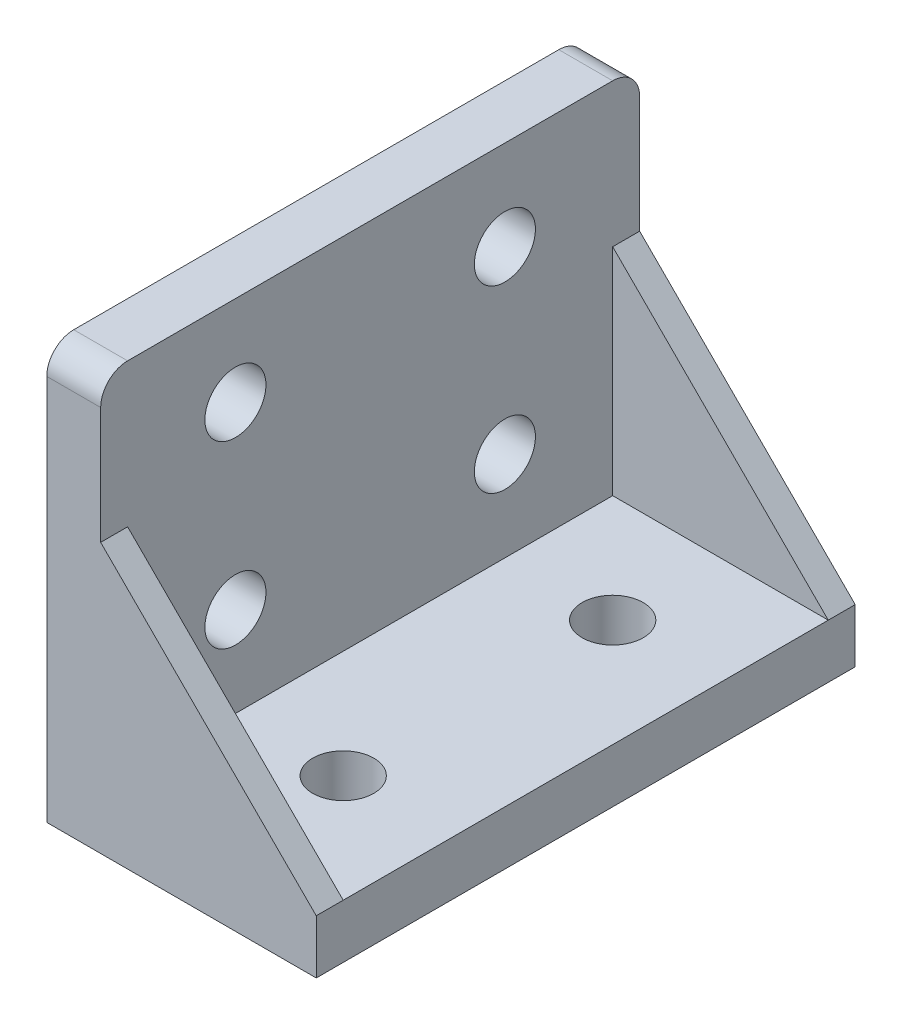
ISO-10303-21;
HEADER;
FILE_DESCRIPTION(('STEP AP214'),'2;1');
FILE_NAME('part.step','',(''),(''),'','','');
FILE_SCHEMA(('AUTOMOTIVE_DESIGN { 1 0 10303 214 1 1 1 1 }'));
ENDSEC;
DATA;
#1=APPLICATION_CONTEXT('core data for automotive mechanical design processes');
#2=APPLICATION_PROTOCOL_DEFINITION('international standard','automotive_design',2000,#1);
#3=PRODUCT_CONTEXT('',#1,'mechanical');
#4=PRODUCT('Part','Part','',(#3));
#5=PRODUCT_RELATED_PRODUCT_CATEGORY('part','',(#4));
#6=PRODUCT_DEFINITION_FORMATION('','',#4);
#7=PRODUCT_DEFINITION_CONTEXT('part definition',#1,'design');
#8=PRODUCT_DEFINITION('design','',#6,#7);
#9=PRODUCT_DEFINITION_SHAPE('','',#8);
#10=(LENGTH_UNIT() NAMED_UNIT(*) SI_UNIT(.MILLI.,.METRE.));
#11=(NAMED_UNIT(*) PLANE_ANGLE_UNIT() SI_UNIT($,.RADIAN.));
#12=(NAMED_UNIT(*) SI_UNIT($,.STERADIAN.) SOLID_ANGLE_UNIT());
#13=UNCERTAINTY_MEASURE_WITH_UNIT(LENGTH_MEASURE(1.E-05),#10,'distance_accuracy_value','');
#14=(GEOMETRIC_REPRESENTATION_CONTEXT(3) GLOBAL_UNCERTAINTY_ASSIGNED_CONTEXT((#13)) GLOBAL_UNIT_ASSIGNED_CONTEXT((#10,
#11,#12)) REPRESENTATION_CONTEXT('',''));
#15=CARTESIAN_POINT('',(0.,0.,0.));
#16=DIRECTION('',(0.,0.,1.));
#17=DIRECTION('',(1.,0.,0.));
#18=AXIS2_PLACEMENT_3D('',#15,#16,#17);
#19=CARTESIAN_POINT('',(12.,0.,30.));
#20=DIRECTION('',(0.,-1.,0.));
#21=DIRECTION('',(1.,0.,0.));
#22=AXIS2_PLACEMENT_3D('',#19,#20,#21);
#23=PLANE('',#22);
#24=CARTESIAN_POINT('',(6.,0.,22.5));
#25=DIRECTION('',(0.,1.,0.));
#26=DIRECTION('',(0.,0.,1.));
#27=AXIS2_PLACEMENT_3D('',#24,#25,#26);
#28=CIRCLE('',#27,1.7);
#29=CARTESIAN_POINT('',(6.,0.,24.2));
#30=VERTEX_POINT('',#29);
#31=EDGE_CURVE('E304',#30,#30,#28,.T.);
#32=ORIENTED_EDGE('',*,*,#31,.F.);
#33=EDGE_LOOP('',(#32));
#34=FACE_BOUND('',#33,.T.);
#35=CARTESIAN_POINT('',(6.,0.,7.5));
#36=DIRECTION('',(0.,1.,0.));
#37=DIRECTION('',(0.,0.,1.));
#38=AXIS2_PLACEMENT_3D('',#35,#36,#37);
#39=CIRCLE('',#38,1.7);
#40=CARTESIAN_POINT('',(6.,0.,9.2));
#41=VERTEX_POINT('',#40);
#42=EDGE_CURVE('E306',#41,#41,#39,.T.);
#43=ORIENTED_EDGE('',*,*,#42,.F.);
#44=EDGE_LOOP('',(#43));
#45=FACE_BOUND('',#44,.T.);
#46=DIRECTION('',(1.,0.,0.));
#47=VECTOR('',#46,1.);
#48=CARTESIAN_POINT('',(0.,0.,28.5));
#49=LINE('',#48,#47);
#50=CARTESIAN_POINT('',(0.,0.,28.5));
#51=VERTEX_POINT('',#50);
#52=CARTESIAN_POINT('',(12.,0.,28.5));
#53=VERTEX_POINT('',#52);
#54=EDGE_CURVE('E127',#51,#53,#49,.T.);
#55=ORIENTED_EDGE('',*,*,#54,.T.);
#56=DIRECTION('',(0.,0.,-1.));
#57=VECTOR('',#56,1.);
#58=CARTESIAN_POINT('',(12.,0.,30.));
#59=LINE('',#58,#57);
#60=CARTESIAN_POINT('',(12.,0.,1.5));
#61=VERTEX_POINT('',#60);
#62=EDGE_CURVE('E172',#53,#61,#59,.T.);
#63=ORIENTED_EDGE('',*,*,#62,.T.);
#64=DIRECTION('',(1.,0.,0.));
#65=VECTOR('',#64,1.);
#66=CARTESIAN_POINT('',(0.,0.,1.5));
#67=LINE('',#66,#65);
#68=CARTESIAN_POINT('',(0.,0.,1.5));
#69=VERTEX_POINT('',#68);
#70=EDGE_CURVE('E151',#69,#61,#67,.T.);
#71=ORIENTED_EDGE('',*,*,#70,.F.);
#72=DIRECTION('',(0.,0.,-1.));
#73=VECTOR('',#72,1.);
#74=CARTESIAN_POINT('',(0.,0.,30.));
#75=LINE('',#74,#73);
#76=EDGE_CURVE('E192',#51,#69,#75,.T.);
#77=ORIENTED_EDGE('',*,*,#76,.F.);
#78=EDGE_LOOP('',(#55,#63,#71,#77));
#79=FACE_BOUND('',#78,.T.);
#80=ADVANCED_FACE('F35',(#34,#45,#79),#23,.F.);
#81=CARTESIAN_POINT('',(0.,0.,30.));
#82=DIRECTION('',(-1.,0.,0.));
#83=DIRECTION('',(0.,0.,1.));
#84=AXIS2_PLACEMENT_3D('',#81,#82,#83);
#85=PLANE('',#84);
#86=CARTESIAN_POINT('',(0.,15.,7.5));
#87=DIRECTION('',(1.,0.,0.));
#88=DIRECTION('',(0.,0.,-1.));
#89=AXIS2_PLACEMENT_3D('',#86,#87,#88);
#90=CIRCLE('',#89,1.7);
#91=CARTESIAN_POINT('',(0.,15.,5.8));
#92=VERTEX_POINT('',#91);
#93=EDGE_CURVE('E314',#92,#92,#90,.T.);
#94=ORIENTED_EDGE('',*,*,#93,.F.);
#95=EDGE_LOOP('',(#94));
#96=FACE_BOUND('',#95,.T.);
#97=CARTESIAN_POINT('',(0.,15.,22.5));
#98=DIRECTION('',(1.,0.,0.));
#99=DIRECTION('',(0.,0.,-1.));
#100=AXIS2_PLACEMENT_3D('',#97,#98,#99);
#101=CIRCLE('',#100,1.7);
#102=CARTESIAN_POINT('',(0.,15.,20.8));
#103=VERTEX_POINT('',#102);
#104=EDGE_CURVE('E320',#103,#103,#101,.T.);
#105=ORIENTED_EDGE('',*,*,#104,.F.);
#106=EDGE_LOOP('',(#105));
#107=FACE_BOUND('',#106,.T.);
#108=CARTESIAN_POINT('',(0.,5.00000000000001,22.5));
#109=DIRECTION('',(1.,0.,0.));
#110=DIRECTION('',(0.,0.,-1.));
#111=AXIS2_PLACEMENT_3D('',#108,#109,#110);
#112=CIRCLE('',#111,1.7);
#113=CARTESIAN_POINT('',(0.,5.00000000000001,20.8));
#114=VERTEX_POINT('',#113);
#115=EDGE_CURVE('E326',#114,#114,#112,.T.);
#116=ORIENTED_EDGE('',*,*,#115,.F.);
#117=EDGE_LOOP('',(#116));
#118=FACE_BOUND('',#117,.T.);
#119=CARTESIAN_POINT('',(0.,5.00000000000002,7.49999999999999));
#120=DIRECTION('',(1.,0.,0.));
#121=DIRECTION('',(0.,0.,-1.));
#122=AXIS2_PLACEMENT_3D('',#119,#120,#121);
#123=CIRCLE('',#122,1.7);
#124=CARTESIAN_POINT('',(0.,5.00000000000002,5.79999999999999));
#125=VERTEX_POINT('',#124);
#126=EDGE_CURVE('E332',#125,#125,#123,.T.);
#127=ORIENTED_EDGE('',*,*,#126,.F.);
#128=EDGE_LOOP('',(#127));
#129=FACE_BOUND('',#128,.T.);
#130=DIRECTION('',(0.,1.,0.));
#131=VECTOR('',#130,1.);
#132=CARTESIAN_POINT('',(0.,0.,0.));
#133=LINE('',#132,#131);
#134=CARTESIAN_POINT('',(0.,12.,0.));
#135=VERTEX_POINT('',#134);
#136=CARTESIAN_POINT('',(0.,18.5,0.));
#137=VERTEX_POINT('',#136);
#138=EDGE_CURVE('E162',#135,#137,#133,.T.);
#139=ORIENTED_EDGE('',*,*,#138,.T.);
#140=CARTESIAN_POINT('',(0.,18.5,1.5));
#141=DIRECTION('',(-1.,0.,0.));
#142=DIRECTION('',(0.,0.,1.));
#143=AXIS2_PLACEMENT_3D('',#140,#141,#142);
#144=CIRCLE('',#143,1.5);
#145=CARTESIAN_POINT('',(0.,20.,1.5));
#146=VERTEX_POINT('',#145);
#147=EDGE_CURVE('E43',#137,#146,#144,.F.);
#148=ORIENTED_EDGE('',*,*,#147,.T.);
#149=DIRECTION('',(0.,0.,-1.));
#150=VECTOR('',#149,1.);
#151=CARTESIAN_POINT('',(0.,20.,30.));
#152=LINE('',#151,#150);
#153=CARTESIAN_POINT('',(0.,20.,28.5));
#154=VERTEX_POINT('',#153);
#155=EDGE_CURVE('E189',#154,#146,#152,.T.);
#156=ORIENTED_EDGE('',*,*,#155,.F.);
#157=CARTESIAN_POINT('',(0.,18.5,28.5));
#158=DIRECTION('',(-1.,0.,0.));
#159=DIRECTION('',(0.,0.,1.));
#160=AXIS2_PLACEMENT_3D('',#157,#158,#159);
#161=CIRCLE('',#160,1.5);
#162=CARTESIAN_POINT('',(0.,18.5,30.));
#163=VERTEX_POINT('',#162);
#164=EDGE_CURVE('E50',#154,#163,#161,.F.);
#165=ORIENTED_EDGE('',*,*,#164,.T.);
#166=DIRECTION('',(0.,1.,0.));
#167=VECTOR('',#166,1.);
#168=CARTESIAN_POINT('',(0.,0.,30.));
#169=LINE('',#168,#167);
#170=CARTESIAN_POINT('',(0.,12.,30.));
#171=VERTEX_POINT('',#170);
#172=EDGE_CURVE('E140',#171,#163,#169,.T.);
#173=ORIENTED_EDGE('',*,*,#172,.F.);
#174=DIRECTION('',(0.,0.,1.));
#175=VECTOR('',#174,1.);
#176=CARTESIAN_POINT('',(0.,12.,28.5));
#177=LINE('',#176,#175);
#178=CARTESIAN_POINT('',(0.,12.,28.5));
#179=VERTEX_POINT('',#178);
#180=EDGE_CURVE('E134',#179,#171,#177,.T.);
#181=ORIENTED_EDGE('',*,*,#180,.F.);
#182=DIRECTION('',(0.,-1.,0.));
#183=VECTOR('',#182,1.);
#184=CARTESIAN_POINT('',(0.,0.,28.5));
#185=LINE('',#184,#183);
#186=EDGE_CURVE('E122',#179,#51,#185,.T.);
#187=ORIENTED_EDGE('',*,*,#186,.T.);
#188=ORIENTED_EDGE('',*,*,#76,.T.);
#189=DIRECTION('',(0.,-1.,0.));
#190=VECTOR('',#189,1.);
#191=CARTESIAN_POINT('',(0.,12.,1.5));
#192=LINE('',#191,#190);
#193=CARTESIAN_POINT('',(0.,12.,1.5));
#194=VERTEX_POINT('',#193);
#195=EDGE_CURVE('E144',#194,#69,#192,.T.);
#196=ORIENTED_EDGE('',*,*,#195,.F.);
#197=DIRECTION('',(0.,0.,-1.));
#198=VECTOR('',#197,1.);
#199=CARTESIAN_POINT('',(0.,12.,1.5));
#200=LINE('',#199,#198);
#201=EDGE_CURVE('E156',#194,#135,#200,.T.);
#202=ORIENTED_EDGE('',*,*,#201,.T.);
#203=EDGE_LOOP('',(#139,#148,#156,#165,#173,#181,#187,#188,#196,#202));
#204=FACE_BOUND('',#203,.T.);
#205=ADVANCED_FACE('F139',(#96,#107,#118,#129,#204),#85,.F.);
#206=CARTESIAN_POINT('',(0.,20.,30.));
#207=DIRECTION('',(0.,-1.,0.));
#208=DIRECTION('',(1.,0.,0.));
#209=AXIS2_PLACEMENT_3D('',#206,#207,#208);
#210=PLANE('',#209);
#211=ORIENTED_EDGE('',*,*,#155,.T.);
#212=DIRECTION('',(-1.,0.,0.));
#213=VECTOR('',#212,1.);
#214=CARTESIAN_POINT('',(-3.,20.,1.5));
#215=LINE('',#214,#213);
#216=CARTESIAN_POINT('',(-3.,20.,1.5));
#217=VERTEX_POINT('',#216);
#218=EDGE_CURVE('E196',#146,#217,#215,.T.);
#219=ORIENTED_EDGE('',*,*,#218,.T.);
#220=DIRECTION('',(0.,0.,-1.));
#221=VECTOR('',#220,1.);
#222=CARTESIAN_POINT('',(-3.,20.,30.));
#223=LINE('',#222,#221);
#224=CARTESIAN_POINT('',(-3.,20.,28.5));
#225=VERTEX_POINT('',#224);
#226=EDGE_CURVE('E186',#225,#217,#223,.T.);
#227=ORIENTED_EDGE('',*,*,#226,.F.);
#228=DIRECTION('',(-1.,0.,0.));
#229=VECTOR('',#228,1.);
#230=CARTESIAN_POINT('',(0.,20.,28.5));
#231=LINE('',#230,#229);
#232=EDGE_CURVE('E194',#225,#154,#231,.F.);
#233=ORIENTED_EDGE('',*,*,#232,.T.);
#234=EDGE_LOOP('',(#211,#219,#227,#233));
#235=FACE_BOUND('',#234,.T.);
#236=ADVANCED_FACE('F208',(#235),#210,.F.);
#237=CARTESIAN_POINT('',(-3.,20.,30.));
#238=DIRECTION('',(1.,0.,0.));
#239=DIRECTION('',(0.,1.,0.));
#240=AXIS2_PLACEMENT_3D('',#237,#238,#239);
#241=PLANE('',#240);
#242=CARTESIAN_POINT('',(-3.,15.,7.5));
#243=DIRECTION('',(1.,0.,0.));
#244=DIRECTION('',(0.,0.,-1.));
#245=AXIS2_PLACEMENT_3D('',#242,#243,#244);
#246=CIRCLE('',#245,1.7);
#247=CARTESIAN_POINT('',(-3.,15.,5.8));
#248=VERTEX_POINT('',#247);
#249=EDGE_CURVE('E317',#248,#248,#246,.T.);
#250=ORIENTED_EDGE('',*,*,#249,.T.);
#251=EDGE_LOOP('',(#250));
#252=FACE_BOUND('',#251,.T.);
#253=CARTESIAN_POINT('',(-3.,15.,22.5));
#254=DIRECTION('',(1.,0.,0.));
#255=DIRECTION('',(0.,0.,-1.));
#256=AXIS2_PLACEMENT_3D('',#253,#254,#255);
#257=CIRCLE('',#256,1.7);
#258=CARTESIAN_POINT('',(-3.,15.,20.8));
#259=VERTEX_POINT('',#258);
#260=EDGE_CURVE('E323',#259,#259,#257,.T.);
#261=ORIENTED_EDGE('',*,*,#260,.T.);
#262=EDGE_LOOP('',(#261));
#263=FACE_BOUND('',#262,.T.);
#264=CARTESIAN_POINT('',(-3.,5.00000000000001,22.5));
#265=DIRECTION('',(1.,0.,0.));
#266=DIRECTION('',(0.,0.,-1.));
#267=AXIS2_PLACEMENT_3D('',#264,#265,#266);
#268=CIRCLE('',#267,1.7);
#269=CARTESIAN_POINT('',(-3.,5.00000000000001,20.8));
#270=VERTEX_POINT('',#269);
#271=EDGE_CURVE('E329',#270,#270,#268,.T.);
#272=ORIENTED_EDGE('',*,*,#271,.T.);
#273=EDGE_LOOP('',(#272));
#274=FACE_BOUND('',#273,.T.);
#275=CARTESIAN_POINT('',(-3.,5.00000000000002,7.49999999999999));
#276=DIRECTION('',(1.,0.,0.));
#277=DIRECTION('',(0.,0.,-1.));
#278=AXIS2_PLACEMENT_3D('',#275,#276,#277);
#279=CIRCLE('',#278,1.7);
#280=CARTESIAN_POINT('',(-3.,5.00000000000002,5.79999999999999));
#281=VERTEX_POINT('',#280);
#282=EDGE_CURVE('E335',#281,#281,#279,.T.);
#283=ORIENTED_EDGE('',*,*,#282,.T.);
#284=EDGE_LOOP('',(#283));
#285=FACE_BOUND('',#284,.T.);
#286=ORIENTED_EDGE('',*,*,#226,.T.);
#287=CARTESIAN_POINT('',(-3.,18.5,1.5));
#288=DIRECTION('',(1.,0.,0.));
#289=DIRECTION('',(0.,1.,0.));
#290=AXIS2_PLACEMENT_3D('',#287,#288,#289);
#291=CIRCLE('',#290,1.5);
#292=CARTESIAN_POINT('',(-3.,18.5,0.));
#293=VERTEX_POINT('',#292);
#294=EDGE_CURVE('E201',#217,#293,#291,.F.);
#295=ORIENTED_EDGE('',*,*,#294,.T.);
#296=DIRECTION('',(0.,-1.,0.));
#297=VECTOR('',#296,1.);
#298=CARTESIAN_POINT('',(-3.,20.,0.));
#299=LINE('',#298,#297);
#300=CARTESIAN_POINT('',(-3.,-3.,0.));
#301=VERTEX_POINT('',#300);
#302=EDGE_CURVE('E174',#293,#301,#299,.T.);
#303=ORIENTED_EDGE('',*,*,#302,.T.);
#304=DIRECTION('',(0.,0.,-1.));
#305=VECTOR('',#304,1.);
#306=CARTESIAN_POINT('',(-3.,-3.,30.));
#307=LINE('',#306,#305);
#308=CARTESIAN_POINT('',(-3.,-3.,30.));
#309=VERTEX_POINT('',#308);
#310=EDGE_CURVE('E183',#309,#301,#307,.T.);
#311=ORIENTED_EDGE('',*,*,#310,.F.);
#312=DIRECTION('',(0.,-1.,0.));
#313=VECTOR('',#312,1.);
#314=CARTESIAN_POINT('',(-3.,20.,30.));
#315=LINE('',#314,#313);
#316=CARTESIAN_POINT('',(-3.,18.5,30.));
#317=VERTEX_POINT('',#316);
#318=EDGE_CURVE('E164',#317,#309,#315,.T.);
#319=ORIENTED_EDGE('',*,*,#318,.F.);
#320=CARTESIAN_POINT('',(-3.,18.5,28.5));
#321=DIRECTION('',(1.,0.,0.));
#322=DIRECTION('',(0.,1.,0.));
#323=AXIS2_PLACEMENT_3D('',#320,#321,#322);
#324=CIRCLE('',#323,1.5);
#325=EDGE_CURVE('E199',#317,#225,#324,.F.);
#326=ORIENTED_EDGE('',*,*,#325,.T.);
#327=EDGE_LOOP('',(#286,#295,#303,#311,#319,#326));
#328=FACE_BOUND('',#327,.T.);
#329=ADVANCED_FACE('F213',(#252,#263,#274,#285,#328),#241,.F.);
#330=CARTESIAN_POINT('',(-3.,-3.,30.));
#331=DIRECTION('',(0.,1.,0.));
#332=DIRECTION('',(0.,0.,1.));
#333=AXIS2_PLACEMENT_3D('',#330,#331,#332);
#334=PLANE('',#333);
#335=CARTESIAN_POINT('',(6.,-3.,22.5));
#336=DIRECTION('',(0.,1.,0.));
#337=DIRECTION('',(0.,0.,1.));
#338=AXIS2_PLACEMENT_3D('',#335,#336,#337);
#339=CIRCLE('',#338,1.7);
#340=CARTESIAN_POINT('',(6.,-3.,24.2));
#341=VERTEX_POINT('',#340);
#342=EDGE_CURVE('E302',#341,#341,#339,.T.);
#343=ORIENTED_EDGE('',*,*,#342,.T.);
#344=EDGE_LOOP('',(#343));
#345=FACE_BOUND('',#344,.T.);
#346=CARTESIAN_POINT('',(6.,-3.,7.5));
#347=DIRECTION('',(0.,1.,0.));
#348=DIRECTION('',(0.,0.,1.));
#349=AXIS2_PLACEMENT_3D('',#346,#347,#348);
#350=CIRCLE('',#349,1.7);
#351=CARTESIAN_POINT('',(6.,-3.,9.2));
#352=VERTEX_POINT('',#351);
#353=EDGE_CURVE('E311',#352,#352,#350,.T.);
#354=ORIENTED_EDGE('',*,*,#353,.T.);
#355=EDGE_LOOP('',(#354));
#356=FACE_BOUND('',#355,.T.);
#357=DIRECTION('',(1.,0.,0.));
#358=VECTOR('',#357,1.);
#359=CARTESIAN_POINT('',(-3.,-3.,0.));
#360=LINE('',#359,#358);
#361=CARTESIAN_POINT('',(12.,-3.,0.));
#362=VERTEX_POINT('',#361);
#363=EDGE_CURVE('E176',#301,#362,#360,.T.);
#364=ORIENTED_EDGE('',*,*,#363,.T.);
#365=DIRECTION('',(0.,0.,-1.));
#366=VECTOR('',#365,1.);
#367=CARTESIAN_POINT('',(12.,-3.,30.));
#368=LINE('',#367,#366);
#369=CARTESIAN_POINT('',(12.,-3.,30.));
#370=VERTEX_POINT('',#369);
#371=EDGE_CURVE('E180',#370,#362,#368,.T.);
#372=ORIENTED_EDGE('',*,*,#371,.F.);
#373=DIRECTION('',(1.,0.,0.));
#374=VECTOR('',#373,1.);
#375=CARTESIAN_POINT('',(-3.,-3.,30.));
#376=LINE('',#375,#374);
#377=EDGE_CURVE('E167',#309,#370,#376,.T.);
#378=ORIENTED_EDGE('',*,*,#377,.F.);
#379=ORIENTED_EDGE('',*,*,#310,.T.);
#380=EDGE_LOOP('',(#364,#372,#378,#379));
#381=FACE_BOUND('',#380,.T.);
#382=ADVANCED_FACE('F221',(#345,#356,#381),#334,.F.);
#383=CARTESIAN_POINT('',(12.,-3.,30.));
#384=DIRECTION('',(-1.,0.,0.));
#385=DIRECTION('',(0.,-1.,0.));
#386=AXIS2_PLACEMENT_3D('',#383,#384,#385);
#387=PLANE('',#386);
#388=DIRECTION('',(0.,1.,0.));
#389=VECTOR('',#388,1.);
#390=CARTESIAN_POINT('',(12.,-3.,0.));
#391=LINE('',#390,#389);
#392=CARTESIAN_POINT('',(12.,0.,0.));
#393=VERTEX_POINT('',#392);
#394=EDGE_CURVE('E165',#362,#393,#391,.T.);
#395=ORIENTED_EDGE('',*,*,#394,.T.);
#396=DIRECTION('',(0.,0.,-1.));
#397=VECTOR('',#396,1.);
#398=CARTESIAN_POINT('',(12.,0.,1.5));
#399=LINE('',#398,#397);
#400=EDGE_CURVE('E159',#61,#393,#399,.T.);
#401=ORIENTED_EDGE('',*,*,#400,.F.);
#402=ORIENTED_EDGE('',*,*,#62,.F.);
#403=CARTESIAN_POINT('',(12.,0.,30.));
#404=VERTEX_POINT('',#403);
#405=EDGE_CURVE('E136',#404,#53,#59,.T.);
#406=ORIENTED_EDGE('',*,*,#405,.F.);
#407=DIRECTION('',(0.,1.,0.));
#408=VECTOR('',#407,1.);
#409=CARTESIAN_POINT('',(12.,-3.,30.));
#410=LINE('',#409,#408);
#411=EDGE_CURVE('E169',#370,#404,#410,.T.);
#412=ORIENTED_EDGE('',*,*,#411,.F.);
#413=ORIENTED_EDGE('',*,*,#371,.T.);
#414=EDGE_LOOP('',(#395,#401,#402,#406,#412,#413));
#415=FACE_BOUND('',#414,.T.);
#416=ADVANCED_FACE('F225',(#415),#387,.F.);
#417=CARTESIAN_POINT('',(0.,0.,30.));
#418=DIRECTION('',(0.,0.,-1.));
#419=DIRECTION('',(-1.,0.,0.));
#420=AXIS2_PLACEMENT_3D('',#417,#418,#419);
#421=PLANE('',#420);
#422=ORIENTED_EDGE('',*,*,#172,.T.);
#423=DIRECTION('',(-1.,0.,0.));
#424=VECTOR('',#423,1.);
#425=CARTESIAN_POINT('',(0.,18.5,30.));
#426=LINE('',#425,#424);
#427=EDGE_CURVE('E11',#163,#317,#426,.T.);
#428=ORIENTED_EDGE('',*,*,#427,.T.);
#429=ORIENTED_EDGE('',*,*,#318,.T.);
#430=ORIENTED_EDGE('',*,*,#377,.T.);
#431=ORIENTED_EDGE('',*,*,#411,.T.);
#432=DIRECTION('',(-0.707106781186548,0.707106781186548,0.));
#433=VECTOR('',#432,1.);
#434=CARTESIAN_POINT('',(6.,6.,30.));
#435=LINE('',#434,#433);
#436=EDGE_CURVE('E137',#404,#171,#435,.T.);
#437=ORIENTED_EDGE('',*,*,#436,.T.);
#438=EDGE_LOOP('',(#422,#428,#429,#430,#431,#437));
#439=FACE_BOUND('',#438,.T.);
#440=ADVANCED_FACE('F229',(#439),#421,.F.);
#441=CARTESIAN_POINT('',(0.,0.,0.));
#442=DIRECTION('',(0.,0.,-1.));
#443=DIRECTION('',(-1.,0.,0.));
#444=AXIS2_PLACEMENT_3D('',#441,#442,#443);
#445=PLANE('',#444);
#446=ORIENTED_EDGE('',*,*,#302,.F.);
#447=DIRECTION('',(-1.,0.,0.));
#448=VECTOR('',#447,1.);
#449=CARTESIAN_POINT('',(0.,18.5,0.));
#450=LINE('',#449,#448);
#451=EDGE_CURVE('E58',#293,#137,#450,.F.);
#452=ORIENTED_EDGE('',*,*,#451,.T.);
#453=ORIENTED_EDGE('',*,*,#138,.F.);
#454=DIRECTION('',(-0.707106781186548,0.707106781186548,0.));
#455=VECTOR('',#454,1.);
#456=CARTESIAN_POINT('',(12.,0.,0.));
#457=LINE('',#456,#455);
#458=EDGE_CURVE('E141',#393,#135,#457,.T.);
#459=ORIENTED_EDGE('',*,*,#458,.F.);
#460=ORIENTED_EDGE('',*,*,#394,.F.);
#461=ORIENTED_EDGE('',*,*,#363,.F.);
#462=EDGE_LOOP('',(#446,#452,#453,#459,#460,#461));
#463=FACE_BOUND('',#462,.T.);
#464=ADVANCED_FACE('F216',(#463),#445,.T.);
#465=CARTESIAN_POINT('',(12.,0.,1.5));
#466=DIRECTION('',(-0.707106781186547,-0.707106781186547,0.));
#467=DIRECTION('',(0.707106781186548,-0.707106781186548,0.));
#468=AXIS2_PLACEMENT_3D('',#465,#466,#467);
#469=PLANE('',#468);
#470=ORIENTED_EDGE('',*,*,#458,.T.);
#471=ORIENTED_EDGE('',*,*,#201,.F.);
#472=DIRECTION('',(-0.707106781186548,0.707106781186548,0.));
#473=VECTOR('',#472,1.);
#474=CARTESIAN_POINT('',(12.,0.,1.5));
#475=LINE('',#474,#473);
#476=EDGE_CURVE('E154',#61,#194,#475,.T.);
#477=ORIENTED_EDGE('',*,*,#476,.F.);
#478=ORIENTED_EDGE('',*,*,#400,.T.);
#479=EDGE_LOOP('',(#470,#471,#477,#478));
#480=FACE_BOUND('',#479,.T.);
#481=ADVANCED_FACE('F261',(#480),#469,.F.);
#482=CARTESIAN_POINT('',(0.,0.,1.5));
#483=DIRECTION('',(0.,0.,1.));
#484=DIRECTION('',(1.,0.,0.));
#485=AXIS2_PLACEMENT_3D('',#482,#483,#484);
#486=PLANE('',#485);
#487=ORIENTED_EDGE('',*,*,#195,.T.);
#488=ORIENTED_EDGE('',*,*,#70,.T.);
#489=ORIENTED_EDGE('',*,*,#476,.T.);
#490=EDGE_LOOP('',(#487,#488,#489));
#491=FACE_BOUND('',#490,.T.);
#492=ADVANCED_FACE('F266',(#491),#486,.T.);
#493=CARTESIAN_POINT('',(6.,6.,28.5));
#494=DIRECTION('',(0.707106781186547,0.707106781186547,0.));
#495=DIRECTION('',(-0.707106781186548,0.707106781186548,0.));
#496=AXIS2_PLACEMENT_3D('',#493,#494,#495);
#497=PLANE('',#496);
#498=ORIENTED_EDGE('',*,*,#436,.F.);
#499=ORIENTED_EDGE('',*,*,#405,.T.);
#500=DIRECTION('',(-0.707106781186548,0.707106781186548,0.));
#501=VECTOR('',#500,1.);
#502=CARTESIAN_POINT('',(6.,6.,28.5));
#503=LINE('',#502,#501);
#504=EDGE_CURVE('E125',#53,#179,#503,.T.);
#505=ORIENTED_EDGE('',*,*,#504,.T.);
#506=ORIENTED_EDGE('',*,*,#180,.T.);
#507=EDGE_LOOP('',(#498,#499,#505,#506));
#508=FACE_BOUND('',#507,.T.);
#509=ADVANCED_FACE('F133',(#508),#497,.T.);
#510=CARTESIAN_POINT('',(0.,0.,28.5));
#511=DIRECTION('',(0.,0.,1.));
#512=DIRECTION('',(1.,0.,0.));
#513=AXIS2_PLACEMENT_3D('',#510,#511,#512);
#514=PLANE('',#513);
#515=ORIENTED_EDGE('',*,*,#504,.F.);
#516=ORIENTED_EDGE('',*,*,#54,.F.);
#517=ORIENTED_EDGE('',*,*,#186,.F.);
#518=EDGE_LOOP('',(#515,#516,#517));
#519=FACE_BOUND('',#518,.T.);
#520=ADVANCED_FACE('F124',(#519),#514,.F.);
#521=CARTESIAN_POINT('',(0.,5.00000000000002,7.49999999999999));
#522=DIRECTION('',(1.,0.,0.));
#523=DIRECTION('',(0.,0.,-1.));
#524=AXIS2_PLACEMENT_3D('',#521,#522,#523);
#525=CYLINDRICAL_SURFACE('',#524,1.7);
#526=ORIENTED_EDGE('',*,*,#282,.F.);
#527=EDGE_LOOP('',(#526));
#528=FACE_BOUND('',#527,.T.);
#529=ORIENTED_EDGE('',*,*,#126,.T.);
#530=EDGE_LOOP('',(#529));
#531=FACE_BOUND('',#530,.T.);
#532=ADVANCED_FACE('F275',(#528,#531),#525,.F.);
#533=CARTESIAN_POINT('',(0.,5.00000000000001,22.5));
#534=DIRECTION('',(1.,0.,0.));
#535=DIRECTION('',(0.,0.,-1.));
#536=AXIS2_PLACEMENT_3D('',#533,#534,#535);
#537=CYLINDRICAL_SURFACE('',#536,1.7);
#538=ORIENTED_EDGE('',*,*,#271,.F.);
#539=EDGE_LOOP('',(#538));
#540=FACE_BOUND('',#539,.T.);
#541=ORIENTED_EDGE('',*,*,#115,.T.);
#542=EDGE_LOOP('',(#541));
#543=FACE_BOUND('',#542,.T.);
#544=ADVANCED_FACE('F278',(#540,#543),#537,.F.);
#545=CARTESIAN_POINT('',(0.,15.,22.5));
#546=DIRECTION('',(1.,0.,0.));
#547=DIRECTION('',(0.,0.,-1.));
#548=AXIS2_PLACEMENT_3D('',#545,#546,#547);
#549=CYLINDRICAL_SURFACE('',#548,1.7);
#550=ORIENTED_EDGE('',*,*,#260,.F.);
#551=EDGE_LOOP('',(#550));
#552=FACE_BOUND('',#551,.T.);
#553=ORIENTED_EDGE('',*,*,#104,.T.);
#554=EDGE_LOOP('',(#553));
#555=FACE_BOUND('',#554,.T.);
#556=ADVANCED_FACE('F282',(#552,#555),#549,.F.);
#557=CARTESIAN_POINT('',(0.,15.,7.5));
#558=DIRECTION('',(1.,0.,0.));
#559=DIRECTION('',(0.,0.,-1.));
#560=AXIS2_PLACEMENT_3D('',#557,#558,#559);
#561=CYLINDRICAL_SURFACE('',#560,1.7);
#562=ORIENTED_EDGE('',*,*,#249,.F.);
#563=EDGE_LOOP('',(#562));
#564=FACE_BOUND('',#563,.T.);
#565=ORIENTED_EDGE('',*,*,#93,.T.);
#566=EDGE_LOOP('',(#565));
#567=FACE_BOUND('',#566,.T.);
#568=ADVANCED_FACE('F286',(#564,#567),#561,.F.);
#569=CARTESIAN_POINT('',(6.,0.,7.5));
#570=DIRECTION('',(0.,1.,0.));
#571=DIRECTION('',(0.,0.,1.));
#572=AXIS2_PLACEMENT_3D('',#569,#570,#571);
#573=CYLINDRICAL_SURFACE('',#572,1.7);
#574=ORIENTED_EDGE('',*,*,#353,.F.);
#575=EDGE_LOOP('',(#574));
#576=FACE_BOUND('',#575,.T.);
#577=ORIENTED_EDGE('',*,*,#42,.T.);
#578=EDGE_LOOP('',(#577));
#579=FACE_BOUND('',#578,.T.);
#580=ADVANCED_FACE('F290',(#576,#579),#573,.F.);
#581=CARTESIAN_POINT('',(6.,0.,22.5));
#582=DIRECTION('',(0.,1.,0.));
#583=DIRECTION('',(0.,0.,1.));
#584=AXIS2_PLACEMENT_3D('',#581,#582,#583);
#585=CYLINDRICAL_SURFACE('',#584,1.7);
#586=ORIENTED_EDGE('',*,*,#342,.F.);
#587=EDGE_LOOP('',(#586));
#588=FACE_BOUND('',#587,.T.);
#589=ORIENTED_EDGE('',*,*,#31,.T.);
#590=EDGE_LOOP('',(#589));
#591=FACE_BOUND('',#590,.T.);
#592=ADVANCED_FACE('F237',(#588,#591),#585,.F.);
#593=CARTESIAN_POINT('',(0.,18.5,1.5));
#594=DIRECTION('',(1.,0.,0.));
#595=DIRECTION('',(0.,1.,0.));
#596=AXIS2_PLACEMENT_3D('',#593,#594,#595);
#597=CYLINDRICAL_SURFACE('',#596,1.5);
#598=ORIENTED_EDGE('',*,*,#147,.F.);
#599=ORIENTED_EDGE('',*,*,#451,.F.);
#600=ORIENTED_EDGE('',*,*,#294,.F.);
#601=ORIENTED_EDGE('',*,*,#218,.F.);
#602=EDGE_LOOP('',(#598,#599,#600,#601));
#603=FACE_BOUND('',#602,.T.);
#604=ADVANCED_FACE('F211',(#603),#597,.T.);
#605=CARTESIAN_POINT('',(0.,18.5,28.5));
#606=DIRECTION('',(-1.,0.,0.));
#607=DIRECTION('',(0.,-1.,0.));
#608=AXIS2_PLACEMENT_3D('',#605,#606,#607);
#609=CYLINDRICAL_SURFACE('',#608,1.5);
#610=ORIENTED_EDGE('',*,*,#164,.F.);
#611=ORIENTED_EDGE('',*,*,#232,.F.);
#612=ORIENTED_EDGE('',*,*,#325,.F.);
#613=ORIENTED_EDGE('',*,*,#427,.F.);
#614=EDGE_LOOP('',(#610,#611,#612,#613));
#615=FACE_BOUND('',#614,.T.);
#616=ADVANCED_FACE('F37',(#615),#609,.T.);
#617=CLOSED_SHELL('',(#80,#205,#236,#329,#382,#416,#440,#464,#481,#492,#509,#520,#532,#544,#556,
#568,#580,#592,#604,#616));
#618=MANIFOLD_SOLID_BREP('B2',#617);
#619=ADVANCED_BREP_SHAPE_REPRESENTATION('',(#18,#618),#14);
#620=SHAPE_DEFINITION_REPRESENTATION(#9,#619);
ENDSEC;
END-ISO-10303-21;
